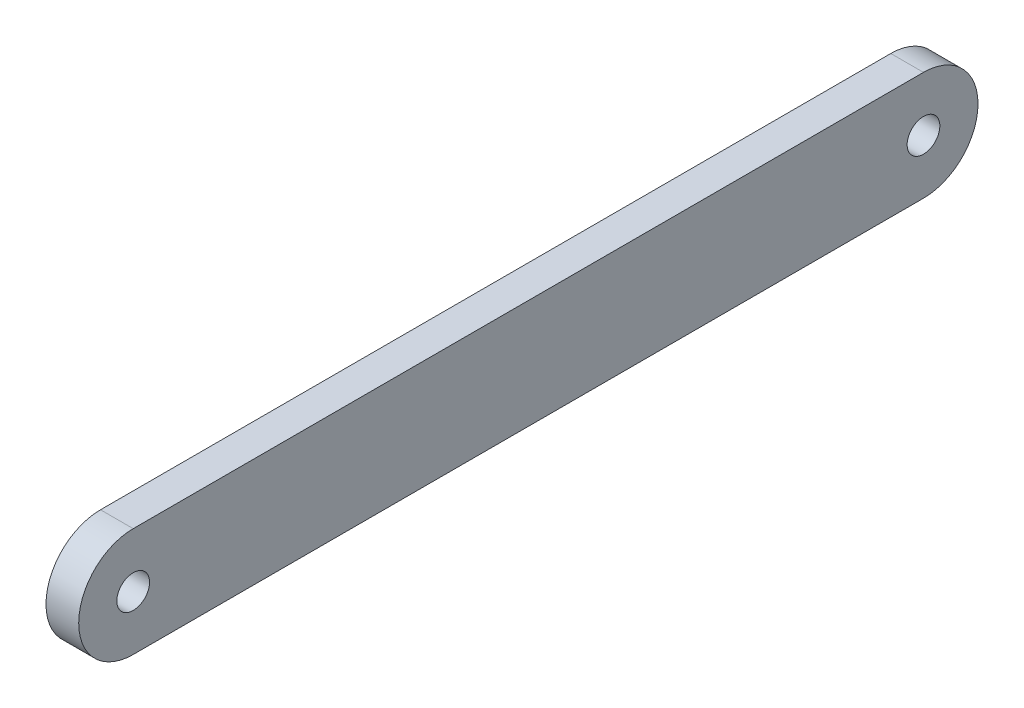
ISO-10303-21;
HEADER;
FILE_DESCRIPTION(('STEP AP214'),'2;1');
FILE_NAME('part.step','',(''),(''),'','','');
FILE_SCHEMA(('AUTOMOTIVE_DESIGN { 1 0 10303 214 1 1 1 1 }'));
ENDSEC;
DATA;
#1=APPLICATION_CONTEXT('core data for automotive mechanical design processes');
#2=APPLICATION_PROTOCOL_DEFINITION('international standard','automotive_design',2000,#1);
#3=PRODUCT_CONTEXT('',#1,'mechanical');
#4=PRODUCT('Part','Part','',(#3));
#5=PRODUCT_RELATED_PRODUCT_CATEGORY('part','',(#4));
#6=PRODUCT_DEFINITION_FORMATION('','',#4);
#7=PRODUCT_DEFINITION_CONTEXT('part definition',#1,'design');
#8=PRODUCT_DEFINITION('design','',#6,#7);
#9=PRODUCT_DEFINITION_SHAPE('','',#8);
#10=(LENGTH_UNIT() NAMED_UNIT(*) SI_UNIT(.MILLI.,.METRE.));
#11=(NAMED_UNIT(*) PLANE_ANGLE_UNIT() SI_UNIT($,.RADIAN.));
#12=(NAMED_UNIT(*) SI_UNIT($,.STERADIAN.) SOLID_ANGLE_UNIT());
#13=UNCERTAINTY_MEASURE_WITH_UNIT(LENGTH_MEASURE(1.E-05),#10,'distance_accuracy_value','');
#14=(GEOMETRIC_REPRESENTATION_CONTEXT(3) GLOBAL_UNCERTAINTY_ASSIGNED_CONTEXT((#13)) GLOBAL_UNIT_ASSIGNED_CONTEXT((#10,
#11,#12)) REPRESENTATION_CONTEXT('',''));
#15=CARTESIAN_POINT('',(0.,0.,0.));
#16=DIRECTION('',(0.,0.,1.));
#17=DIRECTION('',(1.,0.,0.));
#18=AXIS2_PLACEMENT_3D('',#15,#16,#17);
#19=CARTESIAN_POINT('',(1.5,5.,-36.25));
#20=DIRECTION('',(1.,0.,0.));
#21=DIRECTION('',(0.,1.,0.));
#22=AXIS2_PLACEMENT_3D('',#19,#20,#21);
#23=PLANE('',#22);
#24=CARTESIAN_POINT('',(1.5,0.,36.25));
#25=DIRECTION('',(-1.,0.,0.));
#26=DIRECTION('',(0.,1.,0.));
#27=AXIS2_PLACEMENT_3D('',#24,#25,#26);
#28=CIRCLE('',#27,1.5);
#29=CARTESIAN_POINT('',(1.5,1.5,36.25));
#30=VERTEX_POINT('',#29);
#31=EDGE_CURVE('E103',#30,#30,#28,.T.);
#32=ORIENTED_EDGE('',*,*,#31,.T.);
#33=EDGE_LOOP('',(#32));
#34=FACE_BOUND('',#33,.T.);
#35=CARTESIAN_POINT('',(1.5,0.,-36.25));
#36=DIRECTION('',(1.,0.,0.));
#37=DIRECTION('',(0.,1.,0.));
#38=AXIS2_PLACEMENT_3D('',#35,#36,#37);
#39=CIRCLE('',#38,1.5);
#40=CARTESIAN_POINT('',(1.5,1.5,-36.25));
#41=VERTEX_POINT('',#40);
#42=EDGE_CURVE('E100',#41,#41,#39,.T.);
#43=ORIENTED_EDGE('',*,*,#42,.F.);
#44=EDGE_LOOP('',(#43));
#45=FACE_BOUND('',#44,.T.);
#46=DIRECTION('',(0.,0.,1.));
#47=VECTOR('',#46,1.);
#48=CARTESIAN_POINT('',(1.5,5.,-36.25));
#49=LINE('',#48,#47);
#50=CARTESIAN_POINT('',(1.5,5.,-36.25));
#51=VERTEX_POINT('',#50);
#52=CARTESIAN_POINT('',(1.5,5.,36.25));
#53=VERTEX_POINT('',#52);
#54=EDGE_CURVE('E43',#51,#53,#49,.T.);
#55=ORIENTED_EDGE('',*,*,#54,.T.);
#56=CARTESIAN_POINT('',(1.5,0.,36.25));
#57=DIRECTION('',(1.,0.,0.));
#58=DIRECTION('',(0.,0.,-1.));
#59=AXIS2_PLACEMENT_3D('',#56,#57,#58);
#60=CIRCLE('',#59,5.);
#61=CARTESIAN_POINT('',(1.5,-5.,36.25));
#62=VERTEX_POINT('',#61);
#63=EDGE_CURVE('E97',#53,#62,#60,.T.);
#64=ORIENTED_EDGE('',*,*,#63,.T.);
#65=DIRECTION('',(0.,0.,1.));
#66=VECTOR('',#65,1.);
#67=CARTESIAN_POINT('',(1.5,-5.,-36.25));
#68=LINE('',#67,#66);
#69=CARTESIAN_POINT('',(1.5,-5.,-36.25));
#70=VERTEX_POINT('',#69);
#71=EDGE_CURVE('E11',#70,#62,#68,.T.);
#72=ORIENTED_EDGE('',*,*,#71,.F.);
#73=CARTESIAN_POINT('',(1.5,0.,-36.25));
#74=DIRECTION('',(-1.,0.,0.));
#75=DIRECTION('',(0.,0.,1.));
#76=AXIS2_PLACEMENT_3D('',#73,#74,#75);
#77=CIRCLE('',#76,5.);
#78=EDGE_CURVE('E113',#51,#70,#77,.T.);
#79=ORIENTED_EDGE('',*,*,#78,.F.);
#80=EDGE_LOOP('',(#55,#64,#72,#79));
#81=FACE_BOUND('',#80,.T.);
#82=ADVANCED_FACE('F40',(#34,#45,#81),#23,.T.);
#83=CARTESIAN_POINT('',(-1.5,-5.,-36.25));
#84=DIRECTION('',(0.,-1.,0.));
#85=DIRECTION('',(0.,0.,-1.));
#86=AXIS2_PLACEMENT_3D('',#83,#84,#85);
#87=PLANE('',#86);
#88=ORIENTED_EDGE('',*,*,#71,.T.);
#89=DIRECTION('',(1.,0.,0.));
#90=VECTOR('',#89,1.);
#91=CARTESIAN_POINT('',(-1.5,-5.,36.25));
#92=LINE('',#91,#90);
#93=CARTESIAN_POINT('',(-1.5,-5.,36.25));
#94=VERTEX_POINT('',#93);
#95=EDGE_CURVE('E80',#94,#62,#92,.T.);
#96=ORIENTED_EDGE('',*,*,#95,.F.);
#97=DIRECTION('',(0.,0.,1.));
#98=VECTOR('',#97,1.);
#99=CARTESIAN_POINT('',(-1.5,-5.,-36.25));
#100=LINE('',#99,#98);
#101=CARTESIAN_POINT('',(-1.5,-5.,-36.25));
#102=VERTEX_POINT('',#101);
#103=EDGE_CURVE('E48',#102,#94,#100,.T.);
#104=ORIENTED_EDGE('',*,*,#103,.F.);
#105=DIRECTION('',(1.,0.,0.));
#106=VECTOR('',#105,1.);
#107=CARTESIAN_POINT('',(-1.5,-5.,-36.25));
#108=LINE('',#107,#106);
#109=EDGE_CURVE('E118',#102,#70,#108,.T.);
#110=ORIENTED_EDGE('',*,*,#109,.T.);
#111=EDGE_LOOP('',(#88,#96,#104,#110));
#112=FACE_BOUND('',#111,.T.);
#113=ADVANCED_FACE('F81',(#112),#87,.T.);
#114=CARTESIAN_POINT('',(-1.5,5.,-36.25));
#115=DIRECTION('',(-1.,0.,0.));
#116=DIRECTION('',(0.,-1.,0.));
#117=AXIS2_PLACEMENT_3D('',#114,#115,#116);
#118=PLANE('',#117);
#119=CARTESIAN_POINT('',(-1.5,0.,36.25));
#120=DIRECTION('',(-1.,0.,0.));
#121=DIRECTION('',(0.,-1.,0.));
#122=AXIS2_PLACEMENT_3D('',#119,#120,#121);
#123=CIRCLE('',#122,1.5);
#124=CARTESIAN_POINT('',(-1.5,-1.5,36.25));
#125=VERTEX_POINT('',#124);
#126=EDGE_CURVE('E98',#125,#125,#123,.T.);
#127=ORIENTED_EDGE('',*,*,#126,.F.);
#128=EDGE_LOOP('',(#127));
#129=FACE_BOUND('',#128,.T.);
#130=CARTESIAN_POINT('',(-1.5,0.,-36.25));
#131=DIRECTION('',(-1.,0.,0.));
#132=DIRECTION('',(0.,-1.,0.));
#133=AXIS2_PLACEMENT_3D('',#130,#131,#132);
#134=CIRCLE('',#133,1.5);
#135=CARTESIAN_POINT('',(-1.5,-1.5,-36.25));
#136=VERTEX_POINT('',#135);
#137=EDGE_CURVE('E109',#136,#136,#134,.F.);
#138=ORIENTED_EDGE('',*,*,#137,.T.);
#139=EDGE_LOOP('',(#138));
#140=FACE_BOUND('',#139,.T.);
#141=ORIENTED_EDGE('',*,*,#103,.T.);
#142=CARTESIAN_POINT('',(-1.5,0.,36.25));
#143=DIRECTION('',(1.,0.,0.));
#144=DIRECTION('',(0.,0.,-1.));
#145=AXIS2_PLACEMENT_3D('',#142,#143,#144);
#146=CIRCLE('',#145,5.);
#147=CARTESIAN_POINT('',(-1.5,5.,36.25));
#148=VERTEX_POINT('',#147);
#149=EDGE_CURVE('E91',#148,#94,#146,.T.);
#150=ORIENTED_EDGE('',*,*,#149,.F.);
#151=DIRECTION('',(0.,0.,1.));
#152=VECTOR('',#151,1.);
#153=CARTESIAN_POINT('',(-1.5,5.,-36.25));
#154=LINE('',#153,#152);
#155=CARTESIAN_POINT('',(-1.5,5.,-36.25));
#156=VERTEX_POINT('',#155);
#157=EDGE_CURVE('E92',#156,#148,#154,.T.);
#158=ORIENTED_EDGE('',*,*,#157,.F.);
#159=CARTESIAN_POINT('',(-1.5,0.,-36.25));
#160=DIRECTION('',(-1.,0.,0.));
#161=DIRECTION('',(0.,0.,1.));
#162=AXIS2_PLACEMENT_3D('',#159,#160,#161);
#163=CIRCLE('',#162,5.);
#164=EDGE_CURVE('E56',#156,#102,#163,.T.);
#165=ORIENTED_EDGE('',*,*,#164,.T.);
#166=EDGE_LOOP('',(#141,#150,#158,#165));
#167=FACE_BOUND('',#166,.T.);
#168=ADVANCED_FACE('F90',(#129,#140,#167),#118,.T.);
#169=CARTESIAN_POINT('',(-1.5,5.,-36.25));
#170=DIRECTION('',(0.,1.,0.));
#171=DIRECTION('',(-1.,0.,0.));
#172=AXIS2_PLACEMENT_3D('',#169,#170,#171);
#173=PLANE('',#172);
#174=ORIENTED_EDGE('',*,*,#157,.T.);
#175=DIRECTION('',(-1.,0.,0.));
#176=VECTOR('',#175,1.);
#177=CARTESIAN_POINT('',(-1.5,5.,36.25));
#178=LINE('',#177,#176);
#179=EDGE_CURVE('E87',#53,#148,#178,.T.);
#180=ORIENTED_EDGE('',*,*,#179,.F.);
#181=ORIENTED_EDGE('',*,*,#54,.F.);
#182=DIRECTION('',(-1.,0.,0.));
#183=VECTOR('',#182,1.);
#184=CARTESIAN_POINT('',(-1.5,5.,-36.25));
#185=LINE('',#184,#183);
#186=EDGE_CURVE('E86',#51,#156,#185,.T.);
#187=ORIENTED_EDGE('',*,*,#186,.T.);
#188=EDGE_LOOP('',(#174,#180,#181,#187));
#189=FACE_BOUND('',#188,.T.);
#190=ADVANCED_FACE('F123',(#189),#173,.T.);
#191=CARTESIAN_POINT('',(-1.5,0.,-36.25));
#192=DIRECTION('',(-1.,0.,0.));
#193=DIRECTION('',(0.,0.,1.));
#194=AXIS2_PLACEMENT_3D('',#191,#192,#193);
#195=CYLINDRICAL_SURFACE('',#194,5.);
#196=ORIENTED_EDGE('',*,*,#164,.F.);
#197=ORIENTED_EDGE('',*,*,#186,.F.);
#198=ORIENTED_EDGE('',*,*,#78,.T.);
#199=ORIENTED_EDGE('',*,*,#109,.F.);
#200=EDGE_LOOP('',(#196,#197,#198,#199));
#201=FACE_BOUND('',#200,.T.);
#202=ADVANCED_FACE('F125',(#201),#195,.T.);
#203=CARTESIAN_POINT('',(-5.74264068711927,0.,-36.25));
#204=DIRECTION('',(1.,0.,0.));
#205=DIRECTION('',(0.,1.,0.));
#206=AXIS2_PLACEMENT_3D('',#203,#204,#205);
#207=CYLINDRICAL_SURFACE('',#206,1.5);
#208=ORIENTED_EDGE('',*,*,#42,.T.);
#209=EDGE_LOOP('',(#208));
#210=FACE_BOUND('',#209,.T.);
#211=ORIENTED_EDGE('',*,*,#137,.F.);
#212=EDGE_LOOP('',(#211));
#213=FACE_BOUND('',#212,.T.);
#214=ADVANCED_FACE('F130',(#210,#213),#207,.F.);
#215=CARTESIAN_POINT('',(-1.5,0.,36.25));
#216=DIRECTION('',(-1.,0.,0.));
#217=DIRECTION('',(0.,0.,-1.));
#218=AXIS2_PLACEMENT_3D('',#215,#216,#217);
#219=CYLINDRICAL_SURFACE('',#218,5.);
#220=ORIENTED_EDGE('',*,*,#179,.T.);
#221=ORIENTED_EDGE('',*,*,#149,.T.);
#222=ORIENTED_EDGE('',*,*,#95,.T.);
#223=ORIENTED_EDGE('',*,*,#63,.F.);
#224=EDGE_LOOP('',(#220,#221,#222,#223));
#225=FACE_BOUND('',#224,.T.);
#226=ADVANCED_FACE('F95',(#225),#219,.T.);
#227=CARTESIAN_POINT('',(-5.74264068711927,0.,36.25));
#228=DIRECTION('',(1.,0.,0.));
#229=DIRECTION('',(0.,1.,0.));
#230=AXIS2_PLACEMENT_3D('',#227,#228,#229);
#231=CYLINDRICAL_SURFACE('',#230,1.5);
#232=ORIENTED_EDGE('',*,*,#31,.F.);
#233=EDGE_LOOP('',(#232));
#234=FACE_BOUND('',#233,.T.);
#235=ORIENTED_EDGE('',*,*,#126,.T.);
#236=EDGE_LOOP('',(#235));
#237=FACE_BOUND('',#236,.T.);
#238=ADVANCED_FACE('F154',(#234,#237),#231,.F.);
#239=CLOSED_SHELL('',(#82,#113,#168,#190,#202,#214,#226,#238));
#240=MANIFOLD_SOLID_BREP('B2',#239);
#241=ADVANCED_BREP_SHAPE_REPRESENTATION('',(#18,#240),#14);
#242=SHAPE_DEFINITION_REPRESENTATION(#9,#241);
ENDSEC;
END-ISO-10303-21;
